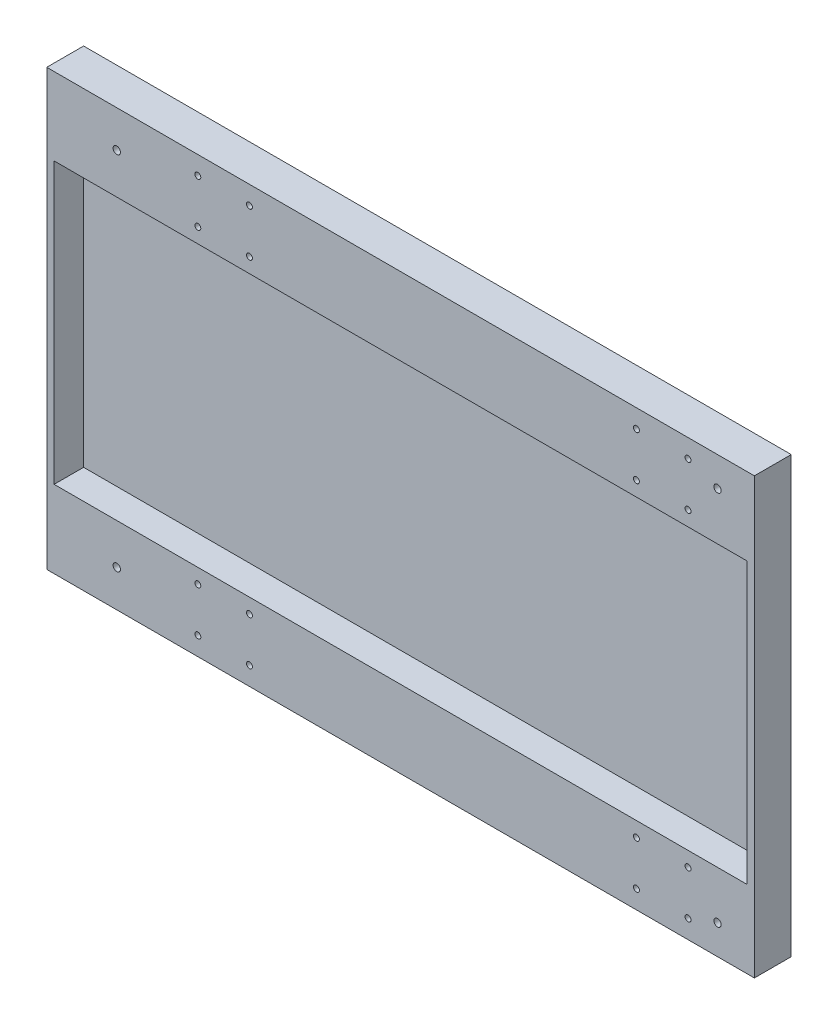
ISO-10303-21;
HEADER;
FILE_DESCRIPTION(('STEP AP214'),'2;1');
FILE_NAME('part.step','',(''),(''),'','','');
FILE_SCHEMA(('AUTOMOTIVE_DESIGN { 1 0 10303 214 1 1 1 1 }'));
ENDSEC;
DATA;
#1=APPLICATION_CONTEXT('core data for automotive mechanical design processes');
#2=APPLICATION_PROTOCOL_DEFINITION('international standard','automotive_design',2000,#1);
#3=PRODUCT_CONTEXT('',#1,'mechanical');
#4=PRODUCT('Part','Part','',(#3));
#5=PRODUCT_RELATED_PRODUCT_CATEGORY('part','',(#4));
#6=PRODUCT_DEFINITION_FORMATION('','',#4);
#7=PRODUCT_DEFINITION_CONTEXT('part definition',#1,'design');
#8=PRODUCT_DEFINITION('design','',#6,#7);
#9=PRODUCT_DEFINITION_SHAPE('','',#8);
#10=(LENGTH_UNIT() NAMED_UNIT(*) SI_UNIT(.MILLI.,.METRE.));
#11=(NAMED_UNIT(*) PLANE_ANGLE_UNIT() SI_UNIT($,.RADIAN.));
#12=(NAMED_UNIT(*) SI_UNIT($,.STERADIAN.) SOLID_ANGLE_UNIT());
#13=UNCERTAINTY_MEASURE_WITH_UNIT(LENGTH_MEASURE(1.E-05),#10,'distance_accuracy_value','');
#14=(GEOMETRIC_REPRESENTATION_CONTEXT(3) GLOBAL_UNCERTAINTY_ASSIGNED_CONTEXT((#13)) GLOBAL_UNIT_ASSIGNED_CONTEXT((#10,
#11,#12)) REPRESENTATION_CONTEXT('',''));
#15=CARTESIAN_POINT('',(0.,0.,0.));
#16=DIRECTION('',(0.,0.,1.));
#17=DIRECTION('',(1.,0.,0.));
#18=AXIS2_PLACEMENT_3D('',#15,#16,#17);
#19=CARTESIAN_POINT('',(609.6,-374.65,12.7));
#20=DIRECTION('',(-1.,0.,0.));
#21=DIRECTION('',(0.,0.,1.));
#22=AXIS2_PLACEMENT_3D('',#19,#20,#21);
#23=PLANE('',#22);
#24=DIRECTION('',(0.,1.,0.));
#25=VECTOR('',#24,1.);
#26=CARTESIAN_POINT('',(609.6,-374.65,0.));
#27=LINE('',#26,#25);
#28=CARTESIAN_POINT('',(609.6,-374.65,0.));
#29=VERTEX_POINT('',#28);
#30=CARTESIAN_POINT('',(609.6,374.65,0.));
#31=VERTEX_POINT('',#30);
#32=EDGE_CURVE('E113',#29,#31,#27,.T.);
#33=ORIENTED_EDGE('',*,*,#32,.T.);
#34=DIRECTION('',(0.,0.,-1.));
#35=VECTOR('',#34,1.);
#36=CARTESIAN_POINT('',(609.6,374.65,12.7));
#37=LINE('',#36,#35);
#38=CARTESIAN_POINT('',(609.599999999999,374.65,63.5));
#39=VERTEX_POINT('',#38);
#40=EDGE_CURVE('E108',#39,#31,#37,.T.);
#41=ORIENTED_EDGE('',*,*,#40,.F.);
#42=DIRECTION('',(0.,1.,0.));
#43=VECTOR('',#42,1.);
#44=CARTESIAN_POINT('',(609.6,0.,63.5));
#45=LINE('',#44,#43);
#46=CARTESIAN_POINT('',(609.599999999999,-374.65,63.5));
#47=VERTEX_POINT('',#46);
#48=EDGE_CURVE('E111',#47,#39,#45,.T.);
#49=ORIENTED_EDGE('',*,*,#48,.F.);
#50=DIRECTION('',(0.,0.,-1.));
#51=VECTOR('',#50,1.);
#52=CARTESIAN_POINT('',(609.6,-374.65,12.7));
#53=LINE('',#52,#51);
#54=EDGE_CURVE('E292',#47,#29,#53,.T.);
#55=ORIENTED_EDGE('',*,*,#54,.T.);
#56=EDGE_LOOP('',(#33,#41,#49,#55));
#57=FACE_BOUND('',#56,.T.);
#58=ADVANCED_FACE('F40',(#57),#23,.F.);
#59=CARTESIAN_POINT('',(-609.6,374.65,12.7));
#60=DIRECTION('',(0.,-1.,0.));
#61=DIRECTION('',(0.,0.,-1.));
#62=AXIS2_PLACEMENT_3D('',#59,#60,#61);
#63=PLANE('',#62);
#64=DIRECTION('',(-1.,0.,0.));
#65=VECTOR('',#64,1.);
#66=CARTESIAN_POINT('',(-609.6,374.65,0.));
#67=LINE('',#66,#65);
#68=CARTESIAN_POINT('',(-609.6,374.65,0.));
#69=VERTEX_POINT('',#68);
#70=EDGE_CURVE('E284',#31,#69,#67,.T.);
#71=ORIENTED_EDGE('',*,*,#70,.T.);
#72=DIRECTION('',(0.,0.,-1.));
#73=VECTOR('',#72,1.);
#74=CARTESIAN_POINT('',(-609.6,374.65,12.7));
#75=LINE('',#74,#73);
#76=CARTESIAN_POINT('',(-609.6,374.65,63.5));
#77=VERTEX_POINT('',#76);
#78=EDGE_CURVE('E117',#77,#69,#75,.T.);
#79=ORIENTED_EDGE('',*,*,#78,.F.);
#80=DIRECTION('',(-1.,0.,0.));
#81=VECTOR('',#80,1.);
#82=CARTESIAN_POINT('',(0.,374.65,63.5));
#83=LINE('',#82,#81);
#84=EDGE_CURVE('E120',#39,#77,#83,.T.);
#85=ORIENTED_EDGE('',*,*,#84,.F.);
#86=ORIENTED_EDGE('',*,*,#40,.T.);
#87=EDGE_LOOP('',(#71,#79,#85,#86));
#88=FACE_BOUND('',#87,.T.);
#89=ADVANCED_FACE('F121',(#88),#63,.F.);
#90=CARTESIAN_POINT('',(-609.6,-374.65,12.7));
#91=DIRECTION('',(1.,0.,0.));
#92=DIRECTION('',(0.,0.,-1.));
#93=AXIS2_PLACEMENT_3D('',#90,#91,#92);
#94=PLANE('',#93);
#95=DIRECTION('',(0.,-1.,0.));
#96=VECTOR('',#95,1.);
#97=CARTESIAN_POINT('',(-609.6,-374.65,0.));
#98=LINE('',#97,#96);
#99=CARTESIAN_POINT('',(-609.6,-374.65,0.));
#100=VERTEX_POINT('',#99);
#101=EDGE_CURVE('E287',#69,#100,#98,.T.);
#102=ORIENTED_EDGE('',*,*,#101,.T.);
#103=DIRECTION('',(0.,0.,-1.));
#104=VECTOR('',#103,1.);
#105=CARTESIAN_POINT('',(-609.6,-374.65,12.7));
#106=LINE('',#105,#104);
#107=CARTESIAN_POINT('',(-609.6,-374.65,63.5));
#108=VERTEX_POINT('',#107);
#109=EDGE_CURVE('E295',#108,#100,#106,.T.);
#110=ORIENTED_EDGE('',*,*,#109,.F.);
#111=DIRECTION('',(0.,-1.,0.));
#112=VECTOR('',#111,1.);
#113=CARTESIAN_POINT('',(-609.6,0.,63.5));
#114=LINE('',#113,#112);
#115=EDGE_CURVE('E127',#77,#108,#114,.T.);
#116=ORIENTED_EDGE('',*,*,#115,.F.);
#117=ORIENTED_EDGE('',*,*,#78,.T.);
#118=EDGE_LOOP('',(#102,#110,#116,#117));
#119=FACE_BOUND('',#118,.T.);
#120=ADVANCED_FACE('F348',(#119),#94,.F.);
#121=CARTESIAN_POINT('',(-609.6,-374.65,12.7));
#122=DIRECTION('',(0.,1.,0.));
#123=DIRECTION('',(0.,0.,1.));
#124=AXIS2_PLACEMENT_3D('',#121,#122,#123);
#125=PLANE('',#124);
#126=DIRECTION('',(1.,0.,0.));
#127=VECTOR('',#126,1.);
#128=CARTESIAN_POINT('',(-609.6,-374.65,0.));
#129=LINE('',#128,#127);
#130=EDGE_CURVE('E63',#100,#29,#129,.T.);
#131=ORIENTED_EDGE('',*,*,#130,.T.);
#132=ORIENTED_EDGE('',*,*,#54,.F.);
#133=DIRECTION('',(1.,0.,0.));
#134=VECTOR('',#133,1.);
#135=CARTESIAN_POINT('',(0.,-374.65,63.5));
#136=LINE('',#135,#134);
#137=EDGE_CURVE('E133',#108,#47,#136,.T.);
#138=ORIENTED_EDGE('',*,*,#137,.F.);
#139=ORIENTED_EDGE('',*,*,#109,.T.);
#140=EDGE_LOOP('',(#131,#132,#138,#139));
#141=FACE_BOUND('',#140,.T.);
#142=ADVANCED_FACE('F352',(#141),#125,.F.);
#143=CARTESIAN_POINT('',(0.,0.,0.));
#144=DIRECTION('',(0.,0.,-1.));
#145=DIRECTION('',(-1.,0.,0.));
#146=AXIS2_PLACEMENT_3D('',#143,#144,#145);
#147=PLANE('',#146);
#148=CARTESIAN_POINT('',(-488.95,-311.15,0.));
#149=DIRECTION('',(0.,0.,1.));
#150=DIRECTION('',(-1.,0.,0.));
#151=AXIS2_PLACEMENT_3D('',#148,#149,#150);
#152=CIRCLE('',#151,6.34999999999994);
#153=CARTESIAN_POINT('',(-495.3,-311.15,0.));
#154=VERTEX_POINT('',#153);
#155=EDGE_CURVE('E371',#154,#154,#152,.T.);
#156=ORIENTED_EDGE('',*,*,#155,.T.);
#157=EDGE_LOOP('',(#156));
#158=FACE_BOUND('',#157,.T.);
#159=CARTESIAN_POINT('',(546.099999999999,-323.85,0.));
#160=DIRECTION('',(0.,0.,1.));
#161=DIRECTION('',(-1.,0.,0.));
#162=AXIS2_PLACEMENT_3D('',#159,#160,#161);
#163=CIRCLE('',#162,6.34999999999982);
#164=CARTESIAN_POINT('',(539.75,-323.85,0.));
#165=VERTEX_POINT('',#164);
#166=EDGE_CURVE('E375',#165,#165,#163,.T.);
#167=ORIENTED_EDGE('',*,*,#166,.T.);
#168=EDGE_LOOP('',(#167));
#169=FACE_BOUND('',#168,.T.);
#170=CARTESIAN_POINT('',(546.099999999999,323.85,0.));
#171=DIRECTION('',(0.,0.,1.));
#172=DIRECTION('',(1.,0.,0.));
#173=AXIS2_PLACEMENT_3D('',#170,#171,#172);
#174=CIRCLE('',#173,6.34999999999982);
#175=CARTESIAN_POINT('',(552.449999999999,323.85,0.));
#176=VERTEX_POINT('',#175);
#177=EDGE_CURVE('E379',#176,#176,#174,.T.);
#178=ORIENTED_EDGE('',*,*,#177,.T.);
#179=EDGE_LOOP('',(#178));
#180=FACE_BOUND('',#179,.T.);
#181=CARTESIAN_POINT('',(-488.95,311.15,0.));
#182=DIRECTION('',(0.,0.,1.));
#183=DIRECTION('',(1.,0.,0.));
#184=AXIS2_PLACEMENT_3D('',#181,#182,#183);
#185=CIRCLE('',#184,6.34999999999994);
#186=CARTESIAN_POINT('',(-482.6,311.15,0.));
#187=VERTEX_POINT('',#186);
#188=EDGE_CURVE('E234',#187,#187,#185,.T.);
#189=ORIENTED_EDGE('',*,*,#188,.T.);
#190=EDGE_LOOP('',(#189));
#191=FACE_BOUND('',#190,.T.);
#192=ORIENTED_EDGE('',*,*,#32,.F.);
#193=ORIENTED_EDGE('',*,*,#130,.F.);
#194=ORIENTED_EDGE('',*,*,#101,.F.);
#195=ORIENTED_EDGE('',*,*,#70,.F.);
#196=EDGE_LOOP('',(#192,#193,#194,#195));
#197=FACE_BOUND('',#196,.T.);
#198=ADVANCED_FACE('F357',(#158,#169,#180,#191,#197),#147,.T.);
#199=CARTESIAN_POINT('',(-596.9,0.,63.5));
#200=DIRECTION('',(1.,0.,0.));
#201=DIRECTION('',(0.,0.,-1.));
#202=AXIS2_PLACEMENT_3D('',#199,#200,#201);
#203=PLANE('',#202);
#204=DIRECTION('',(0.,-1.,0.));
#205=VECTOR('',#204,1.);
#206=CARTESIAN_POINT('',(-596.9,0.,12.7));
#207=LINE('',#206,#205);
#208=CARTESIAN_POINT('',(-596.9,241.3,12.7));
#209=VERTEX_POINT('',#208);
#210=CARTESIAN_POINT('',(-596.9,-241.3,12.7));
#211=VERTEX_POINT('',#210);
#212=EDGE_CURVE('E229',#209,#211,#207,.T.);
#213=ORIENTED_EDGE('',*,*,#212,.F.);
#214=DIRECTION('',(0.,0.,-1.));
#215=VECTOR('',#214,1.);
#216=CARTESIAN_POINT('',(-596.9,241.3,63.5));
#217=LINE('',#216,#215);
#218=CARTESIAN_POINT('',(-596.9,241.3,63.5));
#219=VERTEX_POINT('',#218);
#220=EDGE_CURVE('E279',#219,#209,#217,.T.);
#221=ORIENTED_EDGE('',*,*,#220,.F.);
#222=DIRECTION('',(0.,-1.,0.));
#223=VECTOR('',#222,1.);
#224=CARTESIAN_POINT('',(-596.9,0.,63.5));
#225=LINE('',#224,#223);
#226=CARTESIAN_POINT('',(-596.9,-241.3,63.5));
#227=VERTEX_POINT('',#226);
#228=EDGE_CURVE('E149',#219,#227,#225,.T.);
#229=ORIENTED_EDGE('',*,*,#228,.T.);
#230=DIRECTION('',(0.,0.,-1.));
#231=VECTOR('',#230,1.);
#232=CARTESIAN_POINT('',(-596.9,-241.3,63.5));
#233=LINE('',#232,#231);
#234=EDGE_CURVE('E228',#227,#211,#233,.T.);
#235=ORIENTED_EDGE('',*,*,#234,.T.);
#236=EDGE_LOOP('',(#213,#221,#229,#235));
#237=FACE_BOUND('',#236,.T.);
#238=ADVANCED_FACE('F359',(#237),#203,.T.);
#239=CARTESIAN_POINT('',(0.,241.3,63.5));
#240=DIRECTION('',(0.,1.,0.));
#241=DIRECTION('',(0.,0.,1.));
#242=AXIS2_PLACEMENT_3D('',#239,#240,#241);
#243=PLANE('',#242);
#244=DIRECTION('',(1.,0.,0.));
#245=VECTOR('',#244,1.);
#246=CARTESIAN_POINT('',(0.,241.3,12.7));
#247=LINE('',#246,#245);
#248=CARTESIAN_POINT('',(596.9,241.3,12.7));
#249=VERTEX_POINT('',#248);
#250=EDGE_CURVE('E233',#209,#249,#247,.T.);
#251=ORIENTED_EDGE('',*,*,#250,.T.);
#252=DIRECTION('',(0.,0.,-1.));
#253=VECTOR('',#252,1.);
#254=CARTESIAN_POINT('',(596.9,241.3,63.5));
#255=LINE('',#254,#253);
#256=CARTESIAN_POINT('',(596.9,241.3,63.5));
#257=VERTEX_POINT('',#256);
#258=EDGE_CURVE('E276',#257,#249,#255,.T.);
#259=ORIENTED_EDGE('',*,*,#258,.F.);
#260=DIRECTION('',(1.,0.,0.));
#261=VECTOR('',#260,1.);
#262=CARTESIAN_POINT('',(0.,241.3,63.5));
#263=LINE('',#262,#261);
#264=EDGE_CURVE('E153',#219,#257,#263,.T.);
#265=ORIENTED_EDGE('',*,*,#264,.F.);
#266=ORIENTED_EDGE('',*,*,#220,.T.);
#267=EDGE_LOOP('',(#251,#259,#265,#266));
#268=FACE_BOUND('',#267,.T.);
#269=ADVANCED_FACE('F366',(#268),#243,.F.);
#270=CARTESIAN_POINT('',(596.9,0.,63.5));
#271=DIRECTION('',(1.,0.,0.));
#272=DIRECTION('',(0.,0.,-1.));
#273=AXIS2_PLACEMENT_3D('',#270,#271,#272);
#274=PLANE('',#273);
#275=DIRECTION('',(0.,-1.,0.));
#276=VECTOR('',#275,1.);
#277=CARTESIAN_POINT('',(596.9,0.,12.7));
#278=LINE('',#277,#276);
#279=CARTESIAN_POINT('',(596.9,-241.3,12.7));
#280=VERTEX_POINT('',#279);
#281=EDGE_CURVE('E55',#249,#280,#278,.T.);
#282=ORIENTED_EDGE('',*,*,#281,.T.);
#283=DIRECTION('',(0.,0.,-1.));
#284=VECTOR('',#283,1.);
#285=CARTESIAN_POINT('',(596.9,-241.3,63.5));
#286=LINE('',#285,#284);
#287=CARTESIAN_POINT('',(596.9,-241.3,63.5));
#288=VERTEX_POINT('',#287);
#289=EDGE_CURVE('E273',#288,#280,#286,.T.);
#290=ORIENTED_EDGE('',*,*,#289,.F.);
#291=DIRECTION('',(0.,-1.,0.));
#292=VECTOR('',#291,1.);
#293=CARTESIAN_POINT('',(596.9,0.,63.5));
#294=LINE('',#293,#292);
#295=EDGE_CURVE('E157',#257,#288,#294,.T.);
#296=ORIENTED_EDGE('',*,*,#295,.F.);
#297=ORIENTED_EDGE('',*,*,#258,.T.);
#298=EDGE_LOOP('',(#282,#290,#296,#297));
#299=FACE_BOUND('',#298,.T.);
#300=ADVANCED_FACE('F442',(#299),#274,.F.);
#301=CARTESIAN_POINT('',(495.3,342.9,63.5));
#302=DIRECTION('',(0.,0.,-1.));
#303=DIRECTION('',(-1.,0.,0.));
#304=AXIS2_PLACEMENT_3D('',#301,#302,#303);
#305=CYLINDRICAL_SURFACE('',#304,5.08000000000002);
#306=CARTESIAN_POINT('',(495.3,342.9,63.5));
#307=DIRECTION('',(0.,0.,1.));
#308=DIRECTION('',(1.,0.,0.));
#309=AXIS2_PLACEMENT_3D('',#306,#307,#308);
#310=CIRCLE('',#309,5.08000000000002);
#311=CARTESIAN_POINT('',(500.38,342.9,63.5));
#312=VERTEX_POINT('',#311);
#313=EDGE_CURVE('E220',#312,#312,#310,.T.);
#314=ORIENTED_EDGE('',*,*,#313,.T.);
#315=EDGE_LOOP('',(#314));
#316=FACE_BOUND('',#315,.T.);
#317=CARTESIAN_POINT('',(495.3,342.9,12.7));
#318=DIRECTION('',(0.,0.,1.));
#319=DIRECTION('',(1.,0.,0.));
#320=AXIS2_PLACEMENT_3D('',#317,#318,#319);
#321=CIRCLE('',#320,5.08000000000002);
#322=CARTESIAN_POINT('',(500.38,342.9,12.7));
#323=VERTEX_POINT('',#322);
#324=EDGE_CURVE('E139',#323,#323,#321,.T.);
#325=ORIENTED_EDGE('',*,*,#324,.F.);
#326=EDGE_LOOP('',(#325));
#327=FACE_BOUND('',#326,.T.);
#328=ADVANCED_FACE('F438',(#316,#327),#305,.F.);
#329=CARTESIAN_POINT('',(495.3,266.7,63.5));
#330=DIRECTION('',(0.,0.,-1.));
#331=DIRECTION('',(-1.,0.,0.));
#332=AXIS2_PLACEMENT_3D('',#329,#330,#331);
#333=CYLINDRICAL_SURFACE('',#332,5.08000000000002);
#334=CARTESIAN_POINT('',(495.3,266.7,63.5));
#335=DIRECTION('',(0.,0.,1.));
#336=DIRECTION('',(1.,0.,0.));
#337=AXIS2_PLACEMENT_3D('',#334,#335,#336);
#338=CIRCLE('',#337,5.08000000000002);
#339=CARTESIAN_POINT('',(500.38,266.7,63.5));
#340=VERTEX_POINT('',#339);
#341=EDGE_CURVE('E216',#340,#340,#338,.T.);
#342=ORIENTED_EDGE('',*,*,#341,.T.);
#343=EDGE_LOOP('',(#342));
#344=FACE_BOUND('',#343,.T.);
#345=CARTESIAN_POINT('',(495.3,266.7,12.7));
#346=DIRECTION('',(0.,0.,1.));
#347=DIRECTION('',(1.,0.,0.));
#348=AXIS2_PLACEMENT_3D('',#345,#346,#347);
#349=CIRCLE('',#348,5.08000000000002);
#350=CARTESIAN_POINT('',(500.38,266.7,12.7));
#351=VERTEX_POINT('',#350);
#352=EDGE_CURVE('E264',#351,#351,#349,.T.);
#353=ORIENTED_EDGE('',*,*,#352,.F.);
#354=EDGE_LOOP('',(#353));
#355=FACE_BOUND('',#354,.T.);
#356=ADVANCED_FACE('F441',(#344,#355),#333,.F.);
#357=CARTESIAN_POINT('',(406.4,266.7,63.5));
#358=DIRECTION('',(0.,0.,-1.));
#359=DIRECTION('',(-1.,0.,0.));
#360=AXIS2_PLACEMENT_3D('',#357,#358,#359);
#361=CYLINDRICAL_SURFACE('',#360,5.07999999999997);
#362=CARTESIAN_POINT('',(406.4,266.7,63.5));
#363=DIRECTION('',(0.,0.,1.));
#364=DIRECTION('',(1.,0.,0.));
#365=AXIS2_PLACEMENT_3D('',#362,#363,#364);
#366=CIRCLE('',#365,5.07999999999997);
#367=CARTESIAN_POINT('',(411.48,266.7,63.5));
#368=VERTEX_POINT('',#367);
#369=EDGE_CURVE('E212',#368,#368,#366,.T.);
#370=ORIENTED_EDGE('',*,*,#369,.T.);
#371=EDGE_LOOP('',(#370));
#372=FACE_BOUND('',#371,.T.);
#373=CARTESIAN_POINT('',(406.4,266.7,12.7));
#374=DIRECTION('',(0.,0.,1.));
#375=DIRECTION('',(1.,0.,0.));
#376=AXIS2_PLACEMENT_3D('',#373,#374,#375);
#377=CIRCLE('',#376,5.07999999999997);
#378=CARTESIAN_POINT('',(411.48,266.7,12.7));
#379=VERTEX_POINT('',#378);
#380=EDGE_CURVE('E260',#379,#379,#377,.T.);
#381=ORIENTED_EDGE('',*,*,#380,.F.);
#382=EDGE_LOOP('',(#381));
#383=FACE_BOUND('',#382,.T.);
#384=ADVANCED_FACE('F446',(#372,#383),#361,.F.);
#385=CARTESIAN_POINT('',(-349.25,342.9,63.5));
#386=DIRECTION('',(0.,0.,-1.));
#387=DIRECTION('',(-1.,0.,0.));
#388=AXIS2_PLACEMENT_3D('',#385,#386,#387);
#389=CYLINDRICAL_SURFACE('',#388,5.07999999999997);
#390=CARTESIAN_POINT('',(-349.25,342.9,63.5));
#391=DIRECTION('',(0.,0.,1.));
#392=DIRECTION('',(1.,0.,0.));
#393=AXIS2_PLACEMENT_3D('',#390,#391,#392);
#394=CIRCLE('',#393,5.07999999999997);
#395=CARTESIAN_POINT('',(-344.17,342.9,63.5));
#396=VERTEX_POINT('',#395);
#397=EDGE_CURVE('E208',#396,#396,#394,.T.);
#398=ORIENTED_EDGE('',*,*,#397,.T.);
#399=EDGE_LOOP('',(#398));
#400=FACE_BOUND('',#399,.T.);
#401=CARTESIAN_POINT('',(-349.25,342.9,12.7));
#402=DIRECTION('',(0.,0.,1.));
#403=DIRECTION('',(1.,0.,0.));
#404=AXIS2_PLACEMENT_3D('',#401,#402,#403);
#405=CIRCLE('',#404,5.07999999999997);
#406=CARTESIAN_POINT('',(-344.17,342.9,12.7));
#407=VERTEX_POINT('',#406);
#408=EDGE_CURVE('E256',#407,#407,#405,.T.);
#409=ORIENTED_EDGE('',*,*,#408,.F.);
#410=EDGE_LOOP('',(#409));
#411=FACE_BOUND('',#410,.T.);
#412=ADVANCED_FACE('F450',(#400,#411),#389,.F.);
#413=CARTESIAN_POINT('',(-260.35,342.9,63.5));
#414=DIRECTION('',(0.,0.,-1.));
#415=DIRECTION('',(-1.,0.,0.));
#416=AXIS2_PLACEMENT_3D('',#413,#414,#415);
#417=CYLINDRICAL_SURFACE('',#416,5.07999999999997);
#418=CARTESIAN_POINT('',(-260.35,342.9,63.5));
#419=DIRECTION('',(0.,0.,1.));
#420=DIRECTION('',(1.,0.,0.));
#421=AXIS2_PLACEMENT_3D('',#418,#419,#420);
#422=CIRCLE('',#421,5.07999999999997);
#423=CARTESIAN_POINT('',(-255.27,342.9,63.5));
#424=VERTEX_POINT('',#423);
#425=EDGE_CURVE('E204',#424,#424,#422,.T.);
#426=ORIENTED_EDGE('',*,*,#425,.T.);
#427=EDGE_LOOP('',(#426));
#428=FACE_BOUND('',#427,.T.);
#429=CARTESIAN_POINT('',(-260.35,342.9,12.7));
#430=DIRECTION('',(0.,0.,1.));
#431=DIRECTION('',(1.,0.,0.));
#432=AXIS2_PLACEMENT_3D('',#429,#430,#431);
#433=CIRCLE('',#432,5.07999999999997);
#434=CARTESIAN_POINT('',(-255.27,342.9,12.7));
#435=VERTEX_POINT('',#434);
#436=EDGE_CURVE('E252',#435,#435,#433,.T.);
#437=ORIENTED_EDGE('',*,*,#436,.F.);
#438=EDGE_LOOP('',(#437));
#439=FACE_BOUND('',#438,.T.);
#440=ADVANCED_FACE('F454',(#428,#439),#417,.F.);
#441=CARTESIAN_POINT('',(-260.35,266.7,63.5));
#442=DIRECTION('',(0.,0.,-1.));
#443=DIRECTION('',(-1.,0.,0.));
#444=AXIS2_PLACEMENT_3D('',#441,#442,#443);
#445=CYLINDRICAL_SURFACE('',#444,5.07999999999997);
#446=CARTESIAN_POINT('',(-260.35,266.7,63.5));
#447=DIRECTION('',(0.,0.,1.));
#448=DIRECTION('',(1.,0.,0.));
#449=AXIS2_PLACEMENT_3D('',#446,#447,#448);
#450=CIRCLE('',#449,5.07999999999997);
#451=CARTESIAN_POINT('',(-255.27,266.7,63.5));
#452=VERTEX_POINT('',#451);
#453=EDGE_CURVE('E200',#452,#452,#450,.T.);
#454=ORIENTED_EDGE('',*,*,#453,.T.);
#455=EDGE_LOOP('',(#454));
#456=FACE_BOUND('',#455,.T.);
#457=CARTESIAN_POINT('',(-260.35,266.7,12.7));
#458=DIRECTION('',(0.,0.,1.));
#459=DIRECTION('',(1.,0.,0.));
#460=AXIS2_PLACEMENT_3D('',#457,#458,#459);
#461=CIRCLE('',#460,5.07999999999997);
#462=CARTESIAN_POINT('',(-255.27,266.7,12.7));
#463=VERTEX_POINT('',#462);
#464=EDGE_CURVE('E248',#463,#463,#461,.T.);
#465=ORIENTED_EDGE('',*,*,#464,.F.);
#466=EDGE_LOOP('',(#465));
#467=FACE_BOUND('',#466,.T.);
#468=ADVANCED_FACE('F458',(#456,#467),#445,.F.);
#469=CARTESIAN_POINT('',(-349.25,266.7,63.5));
#470=DIRECTION('',(0.,0.,-1.));
#471=DIRECTION('',(-1.,0.,0.));
#472=AXIS2_PLACEMENT_3D('',#469,#470,#471);
#473=CYLINDRICAL_SURFACE('',#472,5.07999999999997);
#474=CARTESIAN_POINT('',(-349.25,266.7,63.5));
#475=DIRECTION('',(0.,0.,1.));
#476=DIRECTION('',(1.,0.,0.));
#477=AXIS2_PLACEMENT_3D('',#474,#475,#476);
#478=CIRCLE('',#477,5.07999999999997);
#479=CARTESIAN_POINT('',(-344.17,266.7,63.5));
#480=VERTEX_POINT('',#479);
#481=EDGE_CURVE('E196',#480,#480,#478,.T.);
#482=ORIENTED_EDGE('',*,*,#481,.T.);
#483=EDGE_LOOP('',(#482));
#484=FACE_BOUND('',#483,.T.);
#485=CARTESIAN_POINT('',(-349.25,266.7,12.7));
#486=DIRECTION('',(0.,0.,1.));
#487=DIRECTION('',(1.,0.,0.));
#488=AXIS2_PLACEMENT_3D('',#485,#486,#487);
#489=CIRCLE('',#488,5.07999999999997);
#490=CARTESIAN_POINT('',(-344.17,266.7,12.7));
#491=VERTEX_POINT('',#490);
#492=EDGE_CURVE('E244',#491,#491,#489,.T.);
#493=ORIENTED_EDGE('',*,*,#492,.F.);
#494=EDGE_LOOP('',(#493));
#495=FACE_BOUND('',#494,.T.);
#496=ADVANCED_FACE('F462',(#484,#495),#473,.F.);
#497=CARTESIAN_POINT('',(-260.35,-266.7,63.5));
#498=DIRECTION('',(0.,0.,-1.));
#499=DIRECTION('',(-1.,0.,0.));
#500=AXIS2_PLACEMENT_3D('',#497,#498,#499);
#501=CYLINDRICAL_SURFACE('',#500,5.07999999999997);
#502=CARTESIAN_POINT('',(-260.35,-266.7,63.5));
#503=DIRECTION('',(0.,0.,1.));
#504=DIRECTION('',(1.,0.,0.));
#505=AXIS2_PLACEMENT_3D('',#502,#503,#504);
#506=CIRCLE('',#505,5.07999999999997);
#507=CARTESIAN_POINT('',(-255.27,-266.7,63.5));
#508=VERTEX_POINT('',#507);
#509=EDGE_CURVE('E192',#508,#508,#506,.F.);
#510=ORIENTED_EDGE('',*,*,#509,.F.);
#511=EDGE_LOOP('',(#510));
#512=FACE_BOUND('',#511,.T.);
#513=CARTESIAN_POINT('',(-260.35,-266.7,12.7));
#514=DIRECTION('',(0.,0.,-1.));
#515=DIRECTION('',(-1.,0.,0.));
#516=AXIS2_PLACEMENT_3D('',#513,#514,#515);
#517=CIRCLE('',#516,5.07999999999997);
#518=CARTESIAN_POINT('',(-265.43,-266.7,12.7));
#519=VERTEX_POINT('',#518);
#520=EDGE_CURVE('E11',#519,#519,#517,.T.);
#521=ORIENTED_EDGE('',*,*,#520,.T.);
#522=EDGE_LOOP('',(#521));
#523=FACE_BOUND('',#522,.T.);
#524=ADVANCED_FACE('F466',(#512,#523),#501,.F.);
#525=CARTESIAN_POINT('',(-349.25,-266.7,63.5));
#526=DIRECTION('',(0.,0.,-1.));
#527=DIRECTION('',(-1.,0.,0.));
#528=AXIS2_PLACEMENT_3D('',#525,#526,#527);
#529=CYLINDRICAL_SURFACE('',#528,5.07999999999997);
#530=CARTESIAN_POINT('',(-349.25,-266.7,63.5));
#531=DIRECTION('',(0.,0.,1.));
#532=DIRECTION('',(1.,0.,0.));
#533=AXIS2_PLACEMENT_3D('',#530,#531,#532);
#534=CIRCLE('',#533,5.07999999999997);
#535=CARTESIAN_POINT('',(-344.17,-266.7,63.5));
#536=VERTEX_POINT('',#535);
#537=EDGE_CURVE('E188',#536,#536,#534,.F.);
#538=ORIENTED_EDGE('',*,*,#537,.F.);
#539=EDGE_LOOP('',(#538));
#540=FACE_BOUND('',#539,.T.);
#541=CARTESIAN_POINT('',(-349.25,-266.7,12.7));
#542=DIRECTION('',(0.,0.,-1.));
#543=DIRECTION('',(-1.,0.,0.));
#544=AXIS2_PLACEMENT_3D('',#541,#542,#543);
#545=CIRCLE('',#544,5.07999999999997);
#546=CARTESIAN_POINT('',(-354.33,-266.7,12.7));
#547=VERTEX_POINT('',#546);
#548=EDGE_CURVE('E48',#547,#547,#545,.T.);
#549=ORIENTED_EDGE('',*,*,#548,.T.);
#550=EDGE_LOOP('',(#549));
#551=FACE_BOUND('',#550,.T.);
#552=ADVANCED_FACE('F326',(#540,#551),#529,.F.);
#553=CARTESIAN_POINT('',(406.4,-342.9,63.5));
#554=DIRECTION('',(0.,0.,-1.));
#555=DIRECTION('',(-1.,0.,0.));
#556=AXIS2_PLACEMENT_3D('',#553,#554,#555);
#557=CYLINDRICAL_SURFACE('',#556,5.07999999999997);
#558=CARTESIAN_POINT('',(406.4,-342.9,63.5));
#559=DIRECTION('',(0.,0.,1.));
#560=DIRECTION('',(1.,0.,0.));
#561=AXIS2_PLACEMENT_3D('',#558,#559,#560);
#562=CIRCLE('',#561,5.07999999999997);
#563=CARTESIAN_POINT('',(411.48,-342.9,63.5));
#564=VERTEX_POINT('',#563);
#565=EDGE_CURVE('E184',#564,#564,#562,.F.);
#566=ORIENTED_EDGE('',*,*,#565,.F.);
#567=EDGE_LOOP('',(#566));
#568=FACE_BOUND('',#567,.T.);
#569=CARTESIAN_POINT('',(406.4,-342.9,12.7));
#570=DIRECTION('',(0.,0.,-1.));
#571=DIRECTION('',(-1.,0.,0.));
#572=AXIS2_PLACEMENT_3D('',#569,#570,#571);
#573=CIRCLE('',#572,5.07999999999997);
#574=CARTESIAN_POINT('',(401.32,-342.9,12.7));
#575=VERTEX_POINT('',#574);
#576=EDGE_CURVE('E319',#575,#575,#573,.T.);
#577=ORIENTED_EDGE('',*,*,#576,.T.);
#578=EDGE_LOOP('',(#577));
#579=FACE_BOUND('',#578,.T.);
#580=ADVANCED_FACE('F473',(#568,#579),#557,.F.);
#581=CARTESIAN_POINT('',(495.3,-266.7,63.5));
#582=DIRECTION('',(0.,0.,-1.));
#583=DIRECTION('',(-1.,0.,0.));
#584=AXIS2_PLACEMENT_3D('',#581,#582,#583);
#585=CYLINDRICAL_SURFACE('',#584,5.08000000000002);
#586=CARTESIAN_POINT('',(495.3,-266.7,63.5));
#587=DIRECTION('',(0.,0.,1.));
#588=DIRECTION('',(1.,0.,0.));
#589=AXIS2_PLACEMENT_3D('',#586,#587,#588);
#590=CIRCLE('',#589,5.08000000000002);
#591=CARTESIAN_POINT('',(500.38,-266.7,63.5));
#592=VERTEX_POINT('',#591);
#593=EDGE_CURVE('E180',#592,#592,#590,.F.);
#594=ORIENTED_EDGE('',*,*,#593,.F.);
#595=EDGE_LOOP('',(#594));
#596=FACE_BOUND('',#595,.T.);
#597=CARTESIAN_POINT('',(495.3,-266.7,12.7));
#598=DIRECTION('',(0.,0.,-1.));
#599=DIRECTION('',(-1.,0.,0.));
#600=AXIS2_PLACEMENT_3D('',#597,#598,#599);
#601=CIRCLE('',#600,5.08000000000002);
#602=CARTESIAN_POINT('',(490.22,-266.7,12.7));
#603=VERTEX_POINT('',#602);
#604=EDGE_CURVE('E315',#603,#603,#601,.T.);
#605=ORIENTED_EDGE('',*,*,#604,.T.);
#606=EDGE_LOOP('',(#605));
#607=FACE_BOUND('',#606,.T.);
#608=ADVANCED_FACE('F477',(#596,#607),#585,.F.);
#609=CARTESIAN_POINT('',(406.4,-266.7,63.5));
#610=DIRECTION('',(0.,0.,-1.));
#611=DIRECTION('',(-1.,0.,0.));
#612=AXIS2_PLACEMENT_3D('',#609,#610,#611);
#613=CYLINDRICAL_SURFACE('',#612,5.07999999999997);
#614=CARTESIAN_POINT('',(406.4,-266.7,63.5));
#615=DIRECTION('',(0.,0.,1.));
#616=DIRECTION('',(1.,0.,0.));
#617=AXIS2_PLACEMENT_3D('',#614,#615,#616);
#618=CIRCLE('',#617,5.07999999999997);
#619=CARTESIAN_POINT('',(411.48,-266.7,63.5));
#620=VERTEX_POINT('',#619);
#621=EDGE_CURVE('E176',#620,#620,#618,.F.);
#622=ORIENTED_EDGE('',*,*,#621,.F.);
#623=EDGE_LOOP('',(#622));
#624=FACE_BOUND('',#623,.T.);
#625=CARTESIAN_POINT('',(406.4,-266.7,12.7));
#626=DIRECTION('',(0.,0.,-1.));
#627=DIRECTION('',(-1.,0.,0.));
#628=AXIS2_PLACEMENT_3D('',#625,#626,#627);
#629=CIRCLE('',#628,5.07999999999997);
#630=CARTESIAN_POINT('',(401.32,-266.7,12.7));
#631=VERTEX_POINT('',#630);
#632=EDGE_CURVE('E311',#631,#631,#629,.T.);
#633=ORIENTED_EDGE('',*,*,#632,.T.);
#634=EDGE_LOOP('',(#633));
#635=FACE_BOUND('',#634,.T.);
#636=ADVANCED_FACE('F481',(#624,#635),#613,.F.);
#637=CARTESIAN_POINT('',(495.3,-342.9,63.5));
#638=DIRECTION('',(0.,0.,-1.));
#639=DIRECTION('',(-1.,0.,0.));
#640=AXIS2_PLACEMENT_3D('',#637,#638,#639);
#641=CYLINDRICAL_SURFACE('',#640,5.08000000000002);
#642=CARTESIAN_POINT('',(495.3,-342.9,63.5));
#643=DIRECTION('',(0.,0.,1.));
#644=DIRECTION('',(1.,0.,0.));
#645=AXIS2_PLACEMENT_3D('',#642,#643,#644);
#646=CIRCLE('',#645,5.08000000000002);
#647=CARTESIAN_POINT('',(500.38,-342.9,63.5));
#648=VERTEX_POINT('',#647);
#649=EDGE_CURVE('E172',#648,#648,#646,.F.);
#650=ORIENTED_EDGE('',*,*,#649,.F.);
#651=EDGE_LOOP('',(#650));
#652=FACE_BOUND('',#651,.T.);
#653=CARTESIAN_POINT('',(495.3,-342.9,12.7));
#654=DIRECTION('',(0.,0.,-1.));
#655=DIRECTION('',(-1.,0.,0.));
#656=AXIS2_PLACEMENT_3D('',#653,#654,#655);
#657=CIRCLE('',#656,5.08000000000002);
#658=CARTESIAN_POINT('',(490.22,-342.9,12.7));
#659=VERTEX_POINT('',#658);
#660=EDGE_CURVE('E307',#659,#659,#657,.T.);
#661=ORIENTED_EDGE('',*,*,#660,.T.);
#662=EDGE_LOOP('',(#661));
#663=FACE_BOUND('',#662,.T.);
#664=ADVANCED_FACE('F485',(#652,#663),#641,.F.);
#665=CARTESIAN_POINT('',(-349.25,-342.9,63.5));
#666=DIRECTION('',(0.,0.,-1.));
#667=DIRECTION('',(-1.,0.,0.));
#668=AXIS2_PLACEMENT_3D('',#665,#666,#667);
#669=CYLINDRICAL_SURFACE('',#668,5.07999999999997);
#670=CARTESIAN_POINT('',(-349.25,-342.9,63.5));
#671=DIRECTION('',(0.,0.,1.));
#672=DIRECTION('',(1.,0.,0.));
#673=AXIS2_PLACEMENT_3D('',#670,#671,#672);
#674=CIRCLE('',#673,5.07999999999997);
#675=CARTESIAN_POINT('',(-344.17,-342.9,63.5));
#676=VERTEX_POINT('',#675);
#677=EDGE_CURVE('E168',#676,#676,#674,.F.);
#678=ORIENTED_EDGE('',*,*,#677,.F.);
#679=EDGE_LOOP('',(#678));
#680=FACE_BOUND('',#679,.T.);
#681=CARTESIAN_POINT('',(-349.25,-342.9,12.7));
#682=DIRECTION('',(0.,0.,-1.));
#683=DIRECTION('',(-1.,0.,0.));
#684=AXIS2_PLACEMENT_3D('',#681,#682,#683);
#685=CIRCLE('',#684,5.07999999999997);
#686=CARTESIAN_POINT('',(-354.33,-342.9,12.7));
#687=VERTEX_POINT('',#686);
#688=EDGE_CURVE('E303',#687,#687,#685,.T.);
#689=ORIENTED_EDGE('',*,*,#688,.T.);
#690=EDGE_LOOP('',(#689));
#691=FACE_BOUND('',#690,.T.);
#692=ADVANCED_FACE('F489',(#680,#691),#669,.F.);
#693=CARTESIAN_POINT('',(-260.35,-342.9,63.5));
#694=DIRECTION('',(0.,0.,-1.));
#695=DIRECTION('',(-1.,0.,0.));
#696=AXIS2_PLACEMENT_3D('',#693,#694,#695);
#697=CYLINDRICAL_SURFACE('',#696,5.07999999999997);
#698=CARTESIAN_POINT('',(-260.35,-342.9,63.5));
#699=DIRECTION('',(0.,0.,1.));
#700=DIRECTION('',(1.,0.,0.));
#701=AXIS2_PLACEMENT_3D('',#698,#699,#700);
#702=CIRCLE('',#701,5.07999999999997);
#703=CARTESIAN_POINT('',(-255.27,-342.9,63.5));
#704=VERTEX_POINT('',#703);
#705=EDGE_CURVE('E164',#704,#704,#702,.F.);
#706=ORIENTED_EDGE('',*,*,#705,.F.);
#707=EDGE_LOOP('',(#706));
#708=FACE_BOUND('',#707,.T.);
#709=CARTESIAN_POINT('',(-260.35,-342.9,12.7));
#710=DIRECTION('',(0.,0.,-1.));
#711=DIRECTION('',(-1.,0.,0.));
#712=AXIS2_PLACEMENT_3D('',#709,#710,#711);
#713=CIRCLE('',#712,5.07999999999997);
#714=CARTESIAN_POINT('',(-265.43,-342.9,12.7));
#715=VERTEX_POINT('',#714);
#716=EDGE_CURVE('E116',#715,#715,#713,.T.);
#717=ORIENTED_EDGE('',*,*,#716,.T.);
#718=EDGE_LOOP('',(#717));
#719=FACE_BOUND('',#718,.T.);
#720=ADVANCED_FACE('F493',(#708,#719),#697,.F.);
#721=CARTESIAN_POINT('',(0.,-241.3,63.5));
#722=DIRECTION('',(0.,1.,0.));
#723=DIRECTION('',(0.,0.,1.));
#724=AXIS2_PLACEMENT_3D('',#721,#722,#723);
#725=PLANE('',#724);
#726=DIRECTION('',(1.,0.,0.));
#727=VECTOR('',#726,1.);
#728=CARTESIAN_POINT('',(0.,-241.3,12.7));
#729=LINE('',#728,#727);
#730=EDGE_CURVE('E240',#211,#280,#729,.T.);
#731=ORIENTED_EDGE('',*,*,#730,.F.);
#732=ORIENTED_EDGE('',*,*,#234,.F.);
#733=DIRECTION('',(1.,0.,0.));
#734=VECTOR('',#733,1.);
#735=CARTESIAN_POINT('',(0.,-241.3,63.5));
#736=LINE('',#735,#734);
#737=EDGE_CURVE('E160',#227,#288,#736,.T.);
#738=ORIENTED_EDGE('',*,*,#737,.T.);
#739=ORIENTED_EDGE('',*,*,#289,.T.);
#740=EDGE_LOOP('',(#731,#732,#738,#739));
#741=FACE_BOUND('',#740,.T.);
#742=ADVANCED_FACE('F436',(#741),#725,.T.);
#743=CARTESIAN_POINT('',(406.4,342.9,63.5));
#744=DIRECTION('',(0.,0.,-1.));
#745=DIRECTION('',(-1.,0.,0.));
#746=AXIS2_PLACEMENT_3D('',#743,#744,#745);
#747=CYLINDRICAL_SURFACE('',#746,5.07999999999997);
#748=CARTESIAN_POINT('',(406.4,342.9,63.5));
#749=DIRECTION('',(0.,0.,1.));
#750=DIRECTION('',(1.,0.,0.));
#751=AXIS2_PLACEMENT_3D('',#748,#749,#750);
#752=CIRCLE('',#751,5.07999999999997);
#753=CARTESIAN_POINT('',(411.48,342.9,63.5));
#754=VERTEX_POINT('',#753);
#755=EDGE_CURVE('E224',#754,#754,#752,.T.);
#756=ORIENTED_EDGE('',*,*,#755,.T.);
#757=EDGE_LOOP('',(#756));
#758=FACE_BOUND('',#757,.T.);
#759=CARTESIAN_POINT('',(406.4,342.9,12.7));
#760=DIRECTION('',(0.,0.,1.));
#761=DIRECTION('',(1.,0.,0.));
#762=AXIS2_PLACEMENT_3D('',#759,#760,#761);
#763=CIRCLE('',#762,5.07999999999997);
#764=CARTESIAN_POINT('',(411.48,342.9,12.7));
#765=VERTEX_POINT('',#764);
#766=EDGE_CURVE('E135',#765,#765,#763,.T.);
#767=ORIENTED_EDGE('',*,*,#766,.F.);
#768=EDGE_LOOP('',(#767));
#769=FACE_BOUND('',#768,.T.);
#770=ADVANCED_FACE('F412',(#758,#769),#747,.F.);
#771=CARTESIAN_POINT('',(0.,0.,63.5));
#772=DIRECTION('',(0.,0.,1.));
#773=DIRECTION('',(1.,0.,0.));
#774=AXIS2_PLACEMENT_3D('',#771,#772,#773);
#775=PLANE('',#774);
#776=CARTESIAN_POINT('',(-488.95,-311.15,63.5));
#777=DIRECTION('',(0.,0.,1.));
#778=DIRECTION('',(-1.,0.,0.));
#779=AXIS2_PLACEMENT_3D('',#776,#777,#778);
#780=CIRCLE('',#779,6.34999999999994);
#781=CARTESIAN_POINT('',(-495.3,-311.15,63.5));
#782=VERTEX_POINT('',#781);
#783=EDGE_CURVE('E389',#782,#782,#780,.T.);
#784=ORIENTED_EDGE('',*,*,#783,.F.);
#785=EDGE_LOOP('',(#784));
#786=FACE_BOUND('',#785,.T.);
#787=CARTESIAN_POINT('',(546.099999999999,-323.85,63.5));
#788=DIRECTION('',(0.,0.,1.));
#789=DIRECTION('',(-1.,0.,0.));
#790=AXIS2_PLACEMENT_3D('',#787,#788,#789);
#791=CIRCLE('',#790,6.34999999999982);
#792=CARTESIAN_POINT('',(539.75,-323.85,63.5));
#793=VERTEX_POINT('',#792);
#794=EDGE_CURVE('E395',#793,#793,#791,.T.);
#795=ORIENTED_EDGE('',*,*,#794,.F.);
#796=EDGE_LOOP('',(#795));
#797=FACE_BOUND('',#796,.T.);
#798=CARTESIAN_POINT('',(546.099999999999,323.85,63.5));
#799=DIRECTION('',(0.,0.,1.));
#800=DIRECTION('',(1.,0.,0.));
#801=AXIS2_PLACEMENT_3D('',#798,#799,#800);
#802=CIRCLE('',#801,6.34999999999982);
#803=CARTESIAN_POINT('',(552.449999999999,323.85,63.5));
#804=VERTEX_POINT('',#803);
#805=EDGE_CURVE('E401',#804,#804,#802,.T.);
#806=ORIENTED_EDGE('',*,*,#805,.F.);
#807=EDGE_LOOP('',(#806));
#808=FACE_BOUND('',#807,.T.);
#809=CARTESIAN_POINT('',(-488.95,311.15,63.5));
#810=DIRECTION('',(0.,0.,1.));
#811=DIRECTION('',(1.,0.,0.));
#812=AXIS2_PLACEMENT_3D('',#809,#810,#811);
#813=CIRCLE('',#812,6.34999999999994);
#814=CARTESIAN_POINT('',(-482.6,311.15,63.5));
#815=VERTEX_POINT('',#814);
#816=EDGE_CURVE('E142',#815,#815,#813,.T.);
#817=ORIENTED_EDGE('',*,*,#816,.F.);
#818=EDGE_LOOP('',(#817));
#819=FACE_BOUND('',#818,.T.);
#820=ORIENTED_EDGE('',*,*,#48,.T.);
#821=ORIENTED_EDGE('',*,*,#84,.T.);
#822=ORIENTED_EDGE('',*,*,#115,.T.);
#823=ORIENTED_EDGE('',*,*,#137,.T.);
#824=EDGE_LOOP('',(#820,#821,#822,#823));
#825=FACE_BOUND('',#824,.T.);
#826=ORIENTED_EDGE('',*,*,#228,.F.);
#827=ORIENTED_EDGE('',*,*,#264,.T.);
#828=ORIENTED_EDGE('',*,*,#295,.T.);
#829=ORIENTED_EDGE('',*,*,#737,.F.);
#830=EDGE_LOOP('',(#826,#827,#828,#829));
#831=FACE_BOUND('',#830,.T.);
#832=ORIENTED_EDGE('',*,*,#705,.T.);
#833=EDGE_LOOP('',(#832));
#834=FACE_BOUND('',#833,.T.);
#835=ORIENTED_EDGE('',*,*,#677,.T.);
#836=EDGE_LOOP('',(#835));
#837=FACE_BOUND('',#836,.T.);
#838=ORIENTED_EDGE('',*,*,#649,.T.);
#839=EDGE_LOOP('',(#838));
#840=FACE_BOUND('',#839,.T.);
#841=ORIENTED_EDGE('',*,*,#621,.T.);
#842=EDGE_LOOP('',(#841));
#843=FACE_BOUND('',#842,.T.);
#844=ORIENTED_EDGE('',*,*,#593,.T.);
#845=EDGE_LOOP('',(#844));
#846=FACE_BOUND('',#845,.T.);
#847=ORIENTED_EDGE('',*,*,#565,.T.);
#848=EDGE_LOOP('',(#847));
#849=FACE_BOUND('',#848,.T.);
#850=ORIENTED_EDGE('',*,*,#537,.T.);
#851=EDGE_LOOP('',(#850));
#852=FACE_BOUND('',#851,.T.);
#853=ORIENTED_EDGE('',*,*,#509,.T.);
#854=EDGE_LOOP('',(#853));
#855=FACE_BOUND('',#854,.T.);
#856=ORIENTED_EDGE('',*,*,#481,.F.);
#857=EDGE_LOOP('',(#856));
#858=FACE_BOUND('',#857,.T.);
#859=ORIENTED_EDGE('',*,*,#453,.F.);
#860=EDGE_LOOP('',(#859));
#861=FACE_BOUND('',#860,.T.);
#862=ORIENTED_EDGE('',*,*,#425,.F.);
#863=EDGE_LOOP('',(#862));
#864=FACE_BOUND('',#863,.T.);
#865=ORIENTED_EDGE('',*,*,#397,.F.);
#866=EDGE_LOOP('',(#865));
#867=FACE_BOUND('',#866,.T.);
#868=ORIENTED_EDGE('',*,*,#369,.F.);
#869=EDGE_LOOP('',(#868));
#870=FACE_BOUND('',#869,.T.);
#871=ORIENTED_EDGE('',*,*,#341,.F.);
#872=EDGE_LOOP('',(#871));
#873=FACE_BOUND('',#872,.T.);
#874=ORIENTED_EDGE('',*,*,#313,.F.);
#875=EDGE_LOOP('',(#874));
#876=FACE_BOUND('',#875,.T.);
#877=ORIENTED_EDGE('',*,*,#755,.F.);
#878=EDGE_LOOP('',(#877));
#879=FACE_BOUND('',#878,.T.);
#880=ADVANCED_FACE('F130',(#786,#797,#808,#819,#825,#831,#834,#837,#840,#843,#846,#849,#852,
#855,#858,#861,#864,#867,#870,#873,#876,#879),#775,.T.);
#881=CARTESIAN_POINT('',(0.,0.,12.7));
#882=DIRECTION('',(0.,0.,-1.));
#883=DIRECTION('',(-1.,0.,0.));
#884=AXIS2_PLACEMENT_3D('',#881,#882,#883);
#885=PLANE('',#884);
#886=ORIENTED_EDGE('',*,*,#250,.F.);
#887=ORIENTED_EDGE('',*,*,#212,.T.);
#888=ORIENTED_EDGE('',*,*,#730,.T.);
#889=ORIENTED_EDGE('',*,*,#281,.F.);
#890=EDGE_LOOP('',(#886,#887,#888,#889));
#891=FACE_BOUND('',#890,.T.);
#892=ADVANCED_FACE('F411',(#891),#885,.F.);
#893=ORIENTED_EDGE('',*,*,#716,.F.);
#894=EDGE_LOOP('',(#893));
#895=FACE_BOUND('',#894,.T.);
#896=ADVANCED_FACE('F341',(#895),#885,.F.);
#897=ORIENTED_EDGE('',*,*,#688,.F.);
#898=EDGE_LOOP('',(#897));
#899=FACE_BOUND('',#898,.T.);
#900=ADVANCED_FACE('F560',(#899),#885,.F.);
#901=ORIENTED_EDGE('',*,*,#660,.F.);
#902=EDGE_LOOP('',(#901));
#903=FACE_BOUND('',#902,.T.);
#904=ADVANCED_FACE('F566',(#903),#885,.F.);
#905=ORIENTED_EDGE('',*,*,#632,.F.);
#906=EDGE_LOOP('',(#905));
#907=FACE_BOUND('',#906,.T.);
#908=ADVANCED_FACE('F739',(#907),#885,.F.);
#909=ORIENTED_EDGE('',*,*,#604,.F.);
#910=EDGE_LOOP('',(#909));
#911=FACE_BOUND('',#910,.T.);
#912=ADVANCED_FACE('F339',(#911),#885,.F.);
#913=ORIENTED_EDGE('',*,*,#576,.F.);
#914=EDGE_LOOP('',(#913));
#915=FACE_BOUND('',#914,.T.);
#916=ADVANCED_FACE('F331',(#915),#885,.F.);
#917=ORIENTED_EDGE('',*,*,#548,.F.);
#918=EDGE_LOOP('',(#917));
#919=FACE_BOUND('',#918,.T.);
#920=ADVANCED_FACE('F328',(#919),#885,.F.);
#921=ORIENTED_EDGE('',*,*,#520,.F.);
#922=EDGE_LOOP('',(#921));
#923=FACE_BOUND('',#922,.T.);
#924=ADVANCED_FACE('F330',(#923),#885,.F.);
#925=ORIENTED_EDGE('',*,*,#492,.T.);
#926=EDGE_LOOP('',(#925));
#927=FACE_BOUND('',#926,.T.);
#928=ADVANCED_FACE('F337',(#927),#885,.F.);
#929=ORIENTED_EDGE('',*,*,#464,.T.);
#930=EDGE_LOOP('',(#929));
#931=FACE_BOUND('',#930,.T.);
#932=ADVANCED_FACE('F775',(#931),#885,.F.);
#933=ORIENTED_EDGE('',*,*,#436,.T.);
#934=EDGE_LOOP('',(#933));
#935=FACE_BOUND('',#934,.T.);
#936=ADVANCED_FACE('F783',(#935),#885,.F.);
#937=ORIENTED_EDGE('',*,*,#408,.T.);
#938=EDGE_LOOP('',(#937));
#939=FACE_BOUND('',#938,.T.);
#940=ADVANCED_FACE('F791',(#939),#885,.F.);
#941=ORIENTED_EDGE('',*,*,#380,.T.);
#942=EDGE_LOOP('',(#941));
#943=FACE_BOUND('',#942,.T.);
#944=ADVANCED_FACE('F557',(#943),#885,.F.);
#945=ORIENTED_EDGE('',*,*,#352,.T.);
#946=EDGE_LOOP('',(#945));
#947=FACE_BOUND('',#946,.T.);
#948=ADVANCED_FACE('F553',(#947),#885,.F.);
#949=ORIENTED_EDGE('',*,*,#324,.T.);
#950=EDGE_LOOP('',(#949));
#951=FACE_BOUND('',#950,.T.);
#952=ADVANCED_FACE('F428',(#951),#885,.F.);
#953=ORIENTED_EDGE('',*,*,#766,.T.);
#954=EDGE_LOOP('',(#953));
#955=FACE_BOUND('',#954,.T.);
#956=ADVANCED_FACE('F419',(#955),#885,.F.);
#957=CARTESIAN_POINT('',(-488.95,311.15,0.));
#958=DIRECTION('',(0.,0.,1.));
#959=DIRECTION('',(1.,0.,0.));
#960=AXIS2_PLACEMENT_3D('',#957,#958,#959);
#961=CYLINDRICAL_SURFACE('',#960,6.34999999999994);
#962=ORIENTED_EDGE('',*,*,#188,.F.);
#963=EDGE_LOOP('',(#962));
#964=FACE_BOUND('',#963,.T.);
#965=ORIENTED_EDGE('',*,*,#816,.T.);
#966=EDGE_LOOP('',(#965));
#967=FACE_BOUND('',#966,.T.);
#968=ADVANCED_FACE('F417',(#964,#967),#961,.F.);
#969=CARTESIAN_POINT('',(546.099999999999,323.85,0.));
#970=DIRECTION('',(0.,0.,1.));
#971=DIRECTION('',(1.,0.,0.));
#972=AXIS2_PLACEMENT_3D('',#969,#970,#971);
#973=CYLINDRICAL_SURFACE('',#972,6.34999999999982);
#974=ORIENTED_EDGE('',*,*,#177,.F.);
#975=EDGE_LOOP('',(#974));
#976=FACE_BOUND('',#975,.T.);
#977=ORIENTED_EDGE('',*,*,#805,.T.);
#978=EDGE_LOOP('',(#977));
#979=FACE_BOUND('',#978,.T.);
#980=ADVANCED_FACE('F408',(#976,#979),#973,.F.);
#981=CARTESIAN_POINT('',(546.099999999999,-323.85,0.));
#982=DIRECTION('',(0.,0.,1.));
#983=DIRECTION('',(1.,0.,0.));
#984=AXIS2_PLACEMENT_3D('',#981,#982,#983);
#985=CYLINDRICAL_SURFACE('',#984,6.34999999999982);
#986=ORIENTED_EDGE('',*,*,#166,.F.);
#987=EDGE_LOOP('',(#986));
#988=FACE_BOUND('',#987,.T.);
#989=ORIENTED_EDGE('',*,*,#794,.T.);
#990=EDGE_LOOP('',(#989));
#991=FACE_BOUND('',#990,.T.);
#992=ADVANCED_FACE('F425',(#988,#991),#985,.F.);
#993=CARTESIAN_POINT('',(-488.95,-311.15,0.));
#994=DIRECTION('',(0.,0.,1.));
#995=DIRECTION('',(1.,0.,0.));
#996=AXIS2_PLACEMENT_3D('',#993,#994,#995);
#997=CYLINDRICAL_SURFACE('',#996,6.34999999999994);
#998=ORIENTED_EDGE('',*,*,#155,.F.);
#999=EDGE_LOOP('',(#998));
#1000=FACE_BOUND('',#999,.T.);
#1001=ORIENTED_EDGE('',*,*,#783,.T.);
#1002=EDGE_LOOP('',(#1001));
#1003=FACE_BOUND('',#1002,.T.);
#1004=ADVANCED_FACE('F431',(#1000,#1003),#997,.F.);
#1005=CLOSED_SHELL('',(#58,#89,#120,#142,#198,#238,#269,#300,#328,#356,#384,#412,#440,#468,#496,
#524,#552,#580,#608,#636,#664,#692,#720,#742,#770,#880,#892,#896,#900,#904,#908,#912,#916,#920,
#924,#928,#932,#936,#940,#944,#948,#952,#956,#968,#980,#992,#1004));
#1006=MANIFOLD_SOLID_BREP('B2',#1005);
#1007=ADVANCED_BREP_SHAPE_REPRESENTATION('',(#18,#1006),#14);
#1008=SHAPE_DEFINITION_REPRESENTATION(#9,#1007);
ENDSEC;
END-ISO-10303-21;
